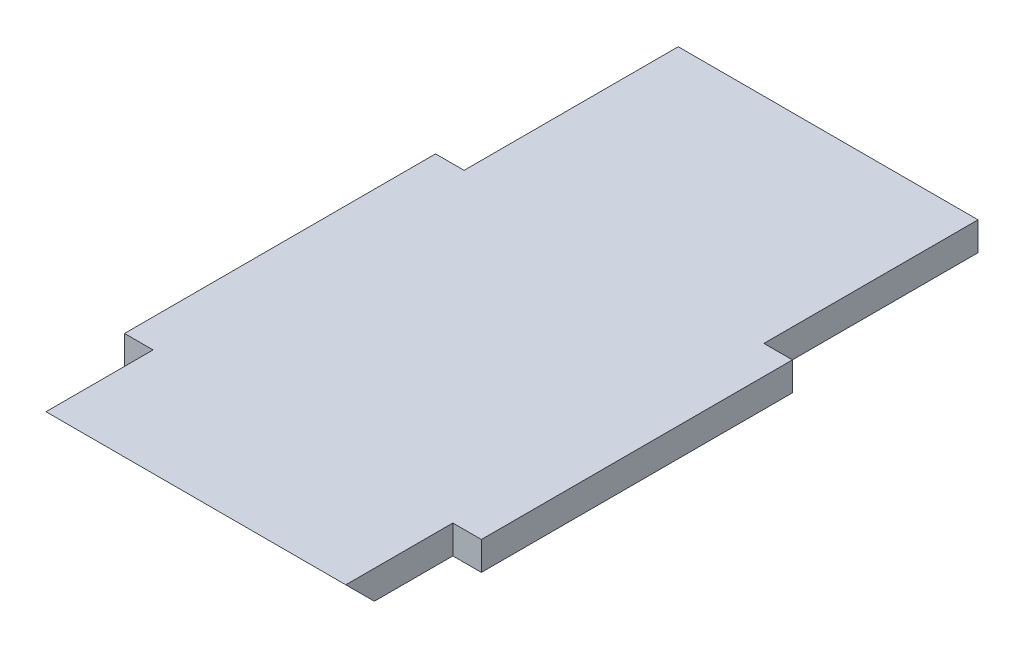
ISO-10303-21;
HEADER;
FILE_DESCRIPTION(('STEP AP214'),'2;1');
FILE_NAME('part.step','',(''),(''),'','','');
FILE_SCHEMA(('AUTOMOTIVE_DESIGN { 1 0 10303 214 1 1 1 1 }'));
ENDSEC;
DATA;
#1=APPLICATION_CONTEXT('core data for automotive mechanical design processes');
#2=APPLICATION_PROTOCOL_DEFINITION('international standard','automotive_design',2000,#1);
#3=PRODUCT_CONTEXT('',#1,'mechanical');
#4=PRODUCT('Part','Part','',(#3));
#5=PRODUCT_RELATED_PRODUCT_CATEGORY('part','',(#4));
#6=PRODUCT_DEFINITION_FORMATION('','',#4);
#7=PRODUCT_DEFINITION_CONTEXT('part definition',#1,'design');
#8=PRODUCT_DEFINITION('design','',#6,#7);
#9=PRODUCT_DEFINITION_SHAPE('','',#8);
#10=(LENGTH_UNIT() NAMED_UNIT(*) SI_UNIT(.MILLI.,.METRE.));
#11=(NAMED_UNIT(*) PLANE_ANGLE_UNIT() SI_UNIT($,.RADIAN.));
#12=(NAMED_UNIT(*) SI_UNIT($,.STERADIAN.) SOLID_ANGLE_UNIT());
#13=UNCERTAINTY_MEASURE_WITH_UNIT(LENGTH_MEASURE(1.E-05),#10,'distance_accuracy_value','');
#14=(GEOMETRIC_REPRESENTATION_CONTEXT(3) GLOBAL_UNCERTAINTY_ASSIGNED_CONTEXT((#13)) GLOBAL_UNIT_ASSIGNED_CONTEXT((#10,
#11,#12)) REPRESENTATION_CONTEXT('',''));
#15=CARTESIAN_POINT('',(0.,0.,0.));
#16=DIRECTION('',(0.,0.,1.));
#17=DIRECTION('',(1.,0.,0.));
#18=AXIS2_PLACEMENT_3D('',#15,#16,#17);
#19=CARTESIAN_POINT('',(0.,8.,-117.16));
#20=DIRECTION('',(0.,0.,1.));
#21=DIRECTION('',(1.,0.,0.));
#22=AXIS2_PLACEMENT_3D('',#19,#20,#21);
#23=PLANE('',#22);
#24=DIRECTION('',(-1.,0.,0.));
#25=VECTOR('',#24,1.);
#26=CARTESIAN_POINT('',(0.,0.,-117.16));
#27=LINE('',#26,#25);
#28=CARTESIAN_POINT('',(100.,0.,-117.16));
#29=VERTEX_POINT('',#28);
#30=CARTESIAN_POINT('',(92.,0.,-117.16));
#31=VERTEX_POINT('',#30);
#32=EDGE_CURVE('E161',#29,#31,#27,.T.);
#33=ORIENTED_EDGE('',*,*,#32,.T.);
#34=DIRECTION('',(0.,-1.,0.));
#35=VECTOR('',#34,1.);
#36=CARTESIAN_POINT('',(92.,8.,-117.16));
#37=LINE('',#36,#35);
#38=CARTESIAN_POINT('',(92.,8.,-117.16));
#39=VERTEX_POINT('',#38);
#40=EDGE_CURVE('E48',#39,#31,#37,.T.);
#41=ORIENTED_EDGE('',*,*,#40,.F.);
#42=DIRECTION('',(-1.,0.,0.));
#43=VECTOR('',#42,1.);
#44=CARTESIAN_POINT('',(0.,8.,-117.16));
#45=LINE('',#44,#43);
#46=CARTESIAN_POINT('',(100.,8.,-117.16));
#47=VERTEX_POINT('',#46);
#48=EDGE_CURVE('E189',#47,#39,#45,.T.);
#49=ORIENTED_EDGE('',*,*,#48,.F.);
#50=DIRECTION('',(0.,-1.,0.));
#51=VECTOR('',#50,1.);
#52=CARTESIAN_POINT('',(100.,8.,-117.16));
#53=LINE('',#52,#51);
#54=EDGE_CURVE('E157',#47,#29,#53,.T.);
#55=ORIENTED_EDGE('',*,*,#54,.T.);
#56=EDGE_LOOP('',(#33,#41,#49,#55));
#57=FACE_BOUND('',#56,.T.);
#58=ADVANCED_FACE('F41',(#57),#23,.F.);
#59=CARTESIAN_POINT('',(92.,8.,0.));
#60=DIRECTION('',(-1.,0.,0.));
#61=DIRECTION('',(0.,0.,1.));
#62=AXIS2_PLACEMENT_3D('',#59,#60,#61);
#63=PLANE('',#62);
#64=DIRECTION('',(0.,0.,-1.));
#65=VECTOR('',#64,1.);
#66=CARTESIAN_POINT('',(92.,0.,0.));
#67=LINE('',#66,#65);
#68=CARTESIAN_POINT('',(92.,0.,-177.16));
#69=VERTEX_POINT('',#68);
#70=EDGE_CURVE('E164',#31,#69,#67,.T.);
#71=ORIENTED_EDGE('',*,*,#70,.T.);
#72=DIRECTION('',(0.,-1.,0.));
#73=VECTOR('',#72,1.);
#74=CARTESIAN_POINT('',(92.,8.,-177.16));
#75=LINE('',#74,#73);
#76=CARTESIAN_POINT('',(92.,8.,-177.16));
#77=VERTEX_POINT('',#76);
#78=EDGE_CURVE('E202',#77,#69,#75,.T.);
#79=ORIENTED_EDGE('',*,*,#78,.F.);
#80=DIRECTION('',(0.,0.,-1.));
#81=VECTOR('',#80,1.);
#82=CARTESIAN_POINT('',(92.,8.,0.));
#83=LINE('',#82,#81);
#84=EDGE_CURVE('E111',#39,#77,#83,.T.);
#85=ORIENTED_EDGE('',*,*,#84,.F.);
#86=ORIENTED_EDGE('',*,*,#40,.T.);
#87=EDGE_LOOP('',(#71,#79,#85,#86));
#88=FACE_BOUND('',#87,.T.);
#89=ADVANCED_FACE('F204',(#88),#63,.F.);
#90=CARTESIAN_POINT('',(0.,8.,-177.16));
#91=DIRECTION('',(0.,0.,-1.));
#92=DIRECTION('',(-1.,0.,0.));
#93=AXIS2_PLACEMENT_3D('',#90,#91,#92);
#94=PLANE('',#93);
#95=DIRECTION('',(1.,0.,0.));
#96=VECTOR('',#95,1.);
#97=CARTESIAN_POINT('',(0.,0.,-177.16));
#98=LINE('',#97,#96);
#99=CARTESIAN_POINT('',(8.,0.,-177.16));
#100=VERTEX_POINT('',#99);
#101=EDGE_CURVE('E168',#100,#69,#98,.T.);
#102=ORIENTED_EDGE('',*,*,#101,.F.);
#103=DIRECTION('',(0.,-1.,0.));
#104=VECTOR('',#103,1.);
#105=CARTESIAN_POINT('',(8.,8.,-177.16));
#106=LINE('',#105,#104);
#107=CARTESIAN_POINT('',(8.,8.,-177.16));
#108=VERTEX_POINT('',#107);
#109=EDGE_CURVE('E200',#108,#100,#106,.T.);
#110=ORIENTED_EDGE('',*,*,#109,.F.);
#111=DIRECTION('',(1.,0.,0.));
#112=VECTOR('',#111,1.);
#113=CARTESIAN_POINT('',(0.,8.,-177.16));
#114=LINE('',#113,#112);
#115=EDGE_CURVE('E216',#108,#77,#114,.T.);
#116=ORIENTED_EDGE('',*,*,#115,.T.);
#117=ORIENTED_EDGE('',*,*,#78,.T.);
#118=EDGE_LOOP('',(#102,#110,#116,#117));
#119=FACE_BOUND('',#118,.T.);
#120=ADVANCED_FACE('F213',(#119),#94,.T.);
#121=CARTESIAN_POINT('',(8.,8.,0.));
#122=DIRECTION('',(-1.,0.,0.));
#123=DIRECTION('',(0.,0.,1.));
#124=AXIS2_PLACEMENT_3D('',#121,#122,#123);
#125=PLANE('',#124);
#126=DIRECTION('',(0.,0.,-1.));
#127=VECTOR('',#126,1.);
#128=CARTESIAN_POINT('',(8.,0.,0.));
#129=LINE('',#128,#127);
#130=CARTESIAN_POINT('',(8.,0.,-117.16));
#131=VERTEX_POINT('',#130);
#132=EDGE_CURVE('E171',#131,#100,#129,.T.);
#133=ORIENTED_EDGE('',*,*,#132,.F.);
#134=DIRECTION('',(0.,-1.,0.));
#135=VECTOR('',#134,1.);
#136=CARTESIAN_POINT('',(8.,8.,-117.16));
#137=LINE('',#136,#135);
#138=CARTESIAN_POINT('',(8.,8.,-117.16));
#139=VERTEX_POINT('',#138);
#140=EDGE_CURVE('E198',#139,#131,#137,.T.);
#141=ORIENTED_EDGE('',*,*,#140,.F.);
#142=DIRECTION('',(0.,0.,-1.));
#143=VECTOR('',#142,1.);
#144=CARTESIAN_POINT('',(8.,8.,0.));
#145=LINE('',#144,#143);
#146=EDGE_CURVE('E219',#139,#108,#145,.T.);
#147=ORIENTED_EDGE('',*,*,#146,.T.);
#148=ORIENTED_EDGE('',*,*,#109,.T.);
#149=EDGE_LOOP('',(#133,#141,#147,#148));
#150=FACE_BOUND('',#149,.T.);
#151=ADVANCED_FACE('F257',(#150),#125,.T.);
#152=CARTESIAN_POINT('',(0.,8.,-117.16));
#153=DIRECTION('',(0.,0.,-1.));
#154=DIRECTION('',(-1.,0.,0.));
#155=AXIS2_PLACEMENT_3D('',#152,#153,#154);
#156=PLANE('',#155);
#157=DIRECTION('',(1.,0.,0.));
#158=VECTOR('',#157,1.);
#159=CARTESIAN_POINT('',(0.,0.,-117.16));
#160=LINE('',#159,#158);
#161=CARTESIAN_POINT('',(0.,0.,-117.16));
#162=VERTEX_POINT('',#161);
#163=EDGE_CURVE('E174',#162,#131,#160,.T.);
#164=ORIENTED_EDGE('',*,*,#163,.F.);
#165=DIRECTION('',(0.,-1.,0.));
#166=VECTOR('',#165,1.);
#167=CARTESIAN_POINT('',(0.,8.,-117.16));
#168=LINE('',#167,#166);
#169=CARTESIAN_POINT('',(0.,8.,-117.16));
#170=VERTEX_POINT('',#169);
#171=EDGE_CURVE('E196',#170,#162,#168,.T.);
#172=ORIENTED_EDGE('',*,*,#171,.F.);
#173=DIRECTION('',(1.,0.,0.));
#174=VECTOR('',#173,1.);
#175=CARTESIAN_POINT('',(0.,8.,-117.16));
#176=LINE('',#175,#174);
#177=EDGE_CURVE('E221',#170,#139,#176,.T.);
#178=ORIENTED_EDGE('',*,*,#177,.T.);
#179=ORIENTED_EDGE('',*,*,#140,.T.);
#180=EDGE_LOOP('',(#164,#172,#178,#179));
#181=FACE_BOUND('',#180,.T.);
#182=ADVANCED_FACE('F255',(#181),#156,.T.);
#183=CARTESIAN_POINT('',(0.,8.,0.));
#184=DIRECTION('',(-1.,0.,0.));
#185=DIRECTION('',(0.,0.,1.));
#186=AXIS2_PLACEMENT_3D('',#183,#184,#185);
#187=PLANE('',#186);
#188=DIRECTION('',(0.,0.,-1.));
#189=VECTOR('',#188,1.);
#190=CARTESIAN_POINT('',(0.,0.,0.));
#191=LINE('',#190,#189);
#192=CARTESIAN_POINT('',(0.,0.,-30.));
#193=VERTEX_POINT('',#192);
#194=EDGE_CURVE('E177',#193,#162,#191,.T.);
#195=ORIENTED_EDGE('',*,*,#194,.F.);
#196=DIRECTION('',(0.,-1.,0.));
#197=VECTOR('',#196,1.);
#198=CARTESIAN_POINT('',(0.,8.,-30.));
#199=LINE('',#198,#197);
#200=CARTESIAN_POINT('',(0.,8.,-30.));
#201=VERTEX_POINT('',#200);
#202=EDGE_CURVE('E194',#201,#193,#199,.T.);
#203=ORIENTED_EDGE('',*,*,#202,.F.);
#204=DIRECTION('',(0.,0.,-1.));
#205=VECTOR('',#204,1.);
#206=CARTESIAN_POINT('',(0.,8.,0.));
#207=LINE('',#206,#205);
#208=EDGE_CURVE('E228',#201,#170,#207,.T.);
#209=ORIENTED_EDGE('',*,*,#208,.T.);
#210=ORIENTED_EDGE('',*,*,#171,.T.);
#211=EDGE_LOOP('',(#195,#203,#209,#210));
#212=FACE_BOUND('',#211,.T.);
#213=ADVANCED_FACE('F251',(#212),#187,.T.);
#214=CARTESIAN_POINT('',(0.,8.,-30.));
#215=DIRECTION('',(0.,0.,-1.));
#216=DIRECTION('',(-1.,0.,0.));
#217=AXIS2_PLACEMENT_3D('',#214,#215,#216);
#218=PLANE('',#217);
#219=DIRECTION('',(1.,0.,0.));
#220=VECTOR('',#219,1.);
#221=CARTESIAN_POINT('',(0.,0.,-30.));
#222=LINE('',#221,#220);
#223=CARTESIAN_POINT('',(7.99999999999999,0.,-30.));
#224=VERTEX_POINT('',#223);
#225=EDGE_CURVE('E180',#193,#224,#222,.T.);
#226=ORIENTED_EDGE('',*,*,#225,.T.);
#227=DIRECTION('',(0.,-1.,0.));
#228=VECTOR('',#227,1.);
#229=CARTESIAN_POINT('',(7.99999999999999,8.,-30.));
#230=LINE('',#229,#228);
#231=CARTESIAN_POINT('',(7.99999999999999,8.,-30.));
#232=VERTEX_POINT('',#231);
#233=EDGE_CURVE('E146',#232,#224,#230,.T.);
#234=ORIENTED_EDGE('',*,*,#233,.F.);
#235=DIRECTION('',(1.,0.,0.));
#236=VECTOR('',#235,1.);
#237=CARTESIAN_POINT('',(0.,8.,-30.));
#238=LINE('',#237,#236);
#239=EDGE_CURVE('E231',#201,#232,#238,.T.);
#240=ORIENTED_EDGE('',*,*,#239,.F.);
#241=ORIENTED_EDGE('',*,*,#202,.T.);
#242=EDGE_LOOP('',(#226,#234,#240,#241));
#243=FACE_BOUND('',#242,.T.);
#244=ADVANCED_FACE('F297',(#243),#218,.F.);
#245=CARTESIAN_POINT('',(8.,8.,0.));
#246=DIRECTION('',(1.,0.,0.));
#247=DIRECTION('',(0.,0.,-1.));
#248=AXIS2_PLACEMENT_3D('',#245,#246,#247);
#249=PLANE('',#248);
#250=DIRECTION('',(0.,0.,1.));
#251=VECTOR('',#250,1.);
#252=CARTESIAN_POINT('',(8.,0.,0.));
#253=LINE('',#252,#251);
#254=CARTESIAN_POINT('',(8.,0.,-7.99999999999986));
#255=VERTEX_POINT('',#254);
#256=EDGE_CURVE('E182',#224,#255,#253,.T.);
#257=ORIENTED_EDGE('',*,*,#256,.T.);
#258=DIRECTION('',(0.,-0.707106781186554,-0.707106781186541));
#259=VECTOR('',#258,1.);
#260=CARTESIAN_POINT('',(8.,8.,0.));
#261=LINE('',#260,#259);
#262=CARTESIAN_POINT('',(8.,8.,0.));
#263=VERTEX_POINT('',#262);
#264=EDGE_CURVE('E55',#263,#255,#261,.T.);
#265=ORIENTED_EDGE('',*,*,#264,.F.);
#266=DIRECTION('',(0.,0.,1.));
#267=VECTOR('',#266,1.);
#268=CARTESIAN_POINT('',(8.,8.,0.));
#269=LINE('',#268,#267);
#270=EDGE_CURVE('E233',#232,#263,#269,.T.);
#271=ORIENTED_EDGE('',*,*,#270,.F.);
#272=ORIENTED_EDGE('',*,*,#233,.T.);
#273=EDGE_LOOP('',(#257,#265,#271,#272));
#274=FACE_BOUND('',#273,.T.);
#275=ADVANCED_FACE('F241',(#274),#249,.F.);
#276=CARTESIAN_POINT('',(92.,8.,0.));
#277=DIRECTION('',(1.,0.,0.));
#278=DIRECTION('',(0.,0.,-1.));
#279=AXIS2_PLACEMENT_3D('',#276,#277,#278);
#280=PLANE('',#279);
#281=DIRECTION('',(0.,0.707106781186554,0.707106781186541));
#282=VECTOR('',#281,1.);
#283=CARTESIAN_POINT('',(92.,8.00000000000003,0.));
#284=LINE('',#283,#282);
#285=CARTESIAN_POINT('',(92.,0.,-7.99999999999988));
#286=VERTEX_POINT('',#285);
#287=CARTESIAN_POINT('',(92.,8.,0.));
#288=VERTEX_POINT('',#287);
#289=EDGE_CURVE('E165',#286,#288,#284,.T.);
#290=ORIENTED_EDGE('',*,*,#289,.F.);
#291=DIRECTION('',(0.,0.,1.));
#292=VECTOR('',#291,1.);
#293=CARTESIAN_POINT('',(92.,0.,0.));
#294=LINE('',#293,#292);
#295=CARTESIAN_POINT('',(92.,0.,-30.));
#296=VERTEX_POINT('',#295);
#297=EDGE_CURVE('E141',#296,#286,#294,.T.);
#298=ORIENTED_EDGE('',*,*,#297,.F.);
#299=DIRECTION('',(0.,-1.,0.));
#300=VECTOR('',#299,1.);
#301=CARTESIAN_POINT('',(92.,8.,-30.));
#302=LINE('',#301,#300);
#303=CARTESIAN_POINT('',(92.,8.,-30.));
#304=VERTEX_POINT('',#303);
#305=EDGE_CURVE('E134',#304,#296,#302,.T.);
#306=ORIENTED_EDGE('',*,*,#305,.F.);
#307=DIRECTION('',(0.,0.,1.));
#308=VECTOR('',#307,1.);
#309=CARTESIAN_POINT('',(92.,8.,0.));
#310=LINE('',#309,#308);
#311=EDGE_CURVE('E139',#304,#288,#310,.T.);
#312=ORIENTED_EDGE('',*,*,#311,.T.);
#313=EDGE_LOOP('',(#290,#298,#306,#312));
#314=FACE_BOUND('',#313,.T.);
#315=ADVANCED_FACE('F137',(#314),#280,.T.);
#316=CARTESIAN_POINT('',(0.,8.,-30.));
#317=DIRECTION('',(0.,0.,1.));
#318=DIRECTION('',(1.,0.,0.));
#319=AXIS2_PLACEMENT_3D('',#316,#317,#318);
#320=PLANE('',#319);
#321=DIRECTION('',(-1.,0.,0.));
#322=VECTOR('',#321,1.);
#323=CARTESIAN_POINT('',(0.,0.,-30.));
#324=LINE('',#323,#322);
#325=CARTESIAN_POINT('',(100.,0.,-30.));
#326=VERTEX_POINT('',#325);
#327=EDGE_CURVE('E186',#326,#296,#324,.T.);
#328=ORIENTED_EDGE('',*,*,#327,.F.);
#329=DIRECTION('',(0.,-1.,0.));
#330=VECTOR('',#329,1.);
#331=CARTESIAN_POINT('',(100.,8.,-30.));
#332=LINE('',#331,#330);
#333=CARTESIAN_POINT('',(100.,8.,-30.));
#334=VERTEX_POINT('',#333);
#335=EDGE_CURVE('E147',#334,#326,#332,.T.);
#336=ORIENTED_EDGE('',*,*,#335,.F.);
#337=DIRECTION('',(-1.,0.,0.));
#338=VECTOR('',#337,1.);
#339=CARTESIAN_POINT('',(0.,8.,-30.));
#340=LINE('',#339,#338);
#341=EDGE_CURVE('E151',#334,#304,#340,.T.);
#342=ORIENTED_EDGE('',*,*,#341,.T.);
#343=ORIENTED_EDGE('',*,*,#305,.T.);
#344=EDGE_LOOP('',(#328,#336,#342,#343));
#345=FACE_BOUND('',#344,.T.);
#346=ADVANCED_FACE('F155',(#345),#320,.T.);
#347=CARTESIAN_POINT('',(100.,8.,0.));
#348=DIRECTION('',(-1.,0.,0.));
#349=DIRECTION('',(0.,0.,1.));
#350=AXIS2_PLACEMENT_3D('',#347,#348,#349);
#351=PLANE('',#350);
#352=DIRECTION('',(0.,0.,-1.));
#353=VECTOR('',#352,1.);
#354=CARTESIAN_POINT('',(100.,0.,0.));
#355=LINE('',#354,#353);
#356=EDGE_CURVE('E102',#326,#29,#355,.T.);
#357=ORIENTED_EDGE('',*,*,#356,.T.);
#358=ORIENTED_EDGE('',*,*,#54,.F.);
#359=DIRECTION('',(0.,0.,-1.));
#360=VECTOR('',#359,1.);
#361=CARTESIAN_POINT('',(100.,8.,0.));
#362=LINE('',#361,#360);
#363=EDGE_CURVE('E63',#334,#47,#362,.T.);
#364=ORIENTED_EDGE('',*,*,#363,.F.);
#365=ORIENTED_EDGE('',*,*,#335,.T.);
#366=EDGE_LOOP('',(#357,#358,#364,#365));
#367=FACE_BOUND('',#366,.T.);
#368=ADVANCED_FACE('F332',(#367),#351,.F.);
#369=CARTESIAN_POINT('',(0.,8.,0.));
#370=DIRECTION('',(0.,1.,0.));
#371=DIRECTION('',(0.,0.,1.));
#372=AXIS2_PLACEMENT_3D('',#369,#370,#371);
#373=PLANE('',#372);
#374=ORIENTED_EDGE('',*,*,#48,.T.);
#375=ORIENTED_EDGE('',*,*,#84,.T.);
#376=ORIENTED_EDGE('',*,*,#115,.F.);
#377=ORIENTED_EDGE('',*,*,#146,.F.);
#378=ORIENTED_EDGE('',*,*,#177,.F.);
#379=ORIENTED_EDGE('',*,*,#208,.F.);
#380=ORIENTED_EDGE('',*,*,#239,.T.);
#381=ORIENTED_EDGE('',*,*,#270,.T.);
#382=DIRECTION('',(1.,0.,0.));
#383=VECTOR('',#382,1.);
#384=CARTESIAN_POINT('',(0.,8.,0.));
#385=LINE('',#384,#383);
#386=EDGE_CURVE('E153',#263,#288,#385,.T.);
#387=ORIENTED_EDGE('',*,*,#386,.T.);
#388=ORIENTED_EDGE('',*,*,#311,.F.);
#389=ORIENTED_EDGE('',*,*,#341,.F.);
#390=ORIENTED_EDGE('',*,*,#363,.T.);
#391=EDGE_LOOP('',(#374,#375,#376,#377,#378,#379,#380,#381,#387,#388,#389,#390));
#392=FACE_BOUND('',#391,.T.);
#393=ADVANCED_FACE('F150',(#392),#373,.T.);
#394=CARTESIAN_POINT('',(0.,0.,0.));
#395=DIRECTION('',(0.,1.,0.));
#396=DIRECTION('',(0.,0.,1.));
#397=AXIS2_PLACEMENT_3D('',#394,#395,#396);
#398=PLANE('',#397);
#399=ORIENTED_EDGE('',*,*,#297,.T.);
#400=DIRECTION('',(-1.,0.,0.));
#401=VECTOR('',#400,1.);
#402=CARTESIAN_POINT('',(0.,0.,-7.99999999999986));
#403=LINE('',#402,#401);
#404=EDGE_CURVE('E11',#286,#255,#403,.T.);
#405=ORIENTED_EDGE('',*,*,#404,.T.);
#406=ORIENTED_EDGE('',*,*,#256,.F.);
#407=ORIENTED_EDGE('',*,*,#225,.F.);
#408=ORIENTED_EDGE('',*,*,#194,.T.);
#409=ORIENTED_EDGE('',*,*,#163,.T.);
#410=ORIENTED_EDGE('',*,*,#132,.T.);
#411=ORIENTED_EDGE('',*,*,#101,.T.);
#412=ORIENTED_EDGE('',*,*,#70,.F.);
#413=ORIENTED_EDGE('',*,*,#32,.F.);
#414=ORIENTED_EDGE('',*,*,#356,.F.);
#415=ORIENTED_EDGE('',*,*,#327,.T.);
#416=EDGE_LOOP('',(#399,#405,#406,#407,#408,#409,#410,#411,#412,#413,#414,#415));
#417=FACE_BOUND('',#416,.T.);
#418=ADVANCED_FACE('F209',(#417),#398,.F.);
#419=CARTESIAN_POINT('',(100.,8.,0.));
#420=DIRECTION('',(0.,0.707106781186541,-0.707106781186554));
#421=DIRECTION('',(0.,0.707106781186554,0.707106781186541));
#422=AXIS2_PLACEMENT_3D('',#419,#420,#421);
#423=PLANE('',#422);
#424=ORIENTED_EDGE('',*,*,#289,.T.);
#425=ORIENTED_EDGE('',*,*,#386,.F.);
#426=ORIENTED_EDGE('',*,*,#264,.T.);
#427=ORIENTED_EDGE('',*,*,#404,.F.);
#428=EDGE_LOOP('',(#424,#425,#426,#427));
#429=FACE_BOUND('',#428,.T.);
#430=ADVANCED_FACE('F246',(#429),#423,.F.);
#431=CLOSED_SHELL('',(#58,#89,#120,#151,#182,#213,#244,#275,#315,#346,#368,#393,#418,#430));
#432=MANIFOLD_SOLID_BREP('B2',#431);
#433=ADVANCED_BREP_SHAPE_REPRESENTATION('',(#18,#432),#14);
#434=SHAPE_DEFINITION_REPRESENTATION(#9,#433);
ENDSEC;
END-ISO-10303-21;
